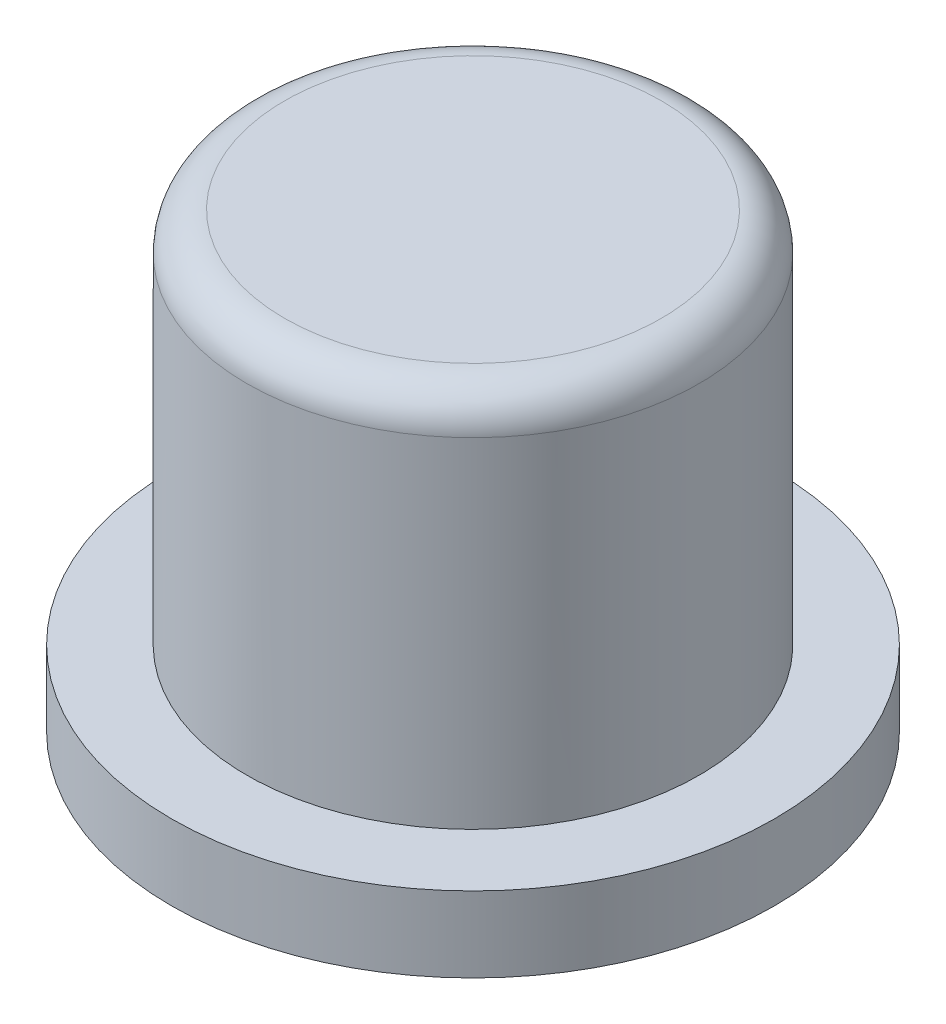
ISO-10303-21;
HEADER;
FILE_DESCRIPTION(('STEP AP214'),'2;1');
FILE_NAME('part.step','',(''),(''),'','','');
FILE_SCHEMA(('AUTOMOTIVE_DESIGN { 1 0 10303 214 1 1 1 1 }'));
ENDSEC;
DATA;
#1=APPLICATION_CONTEXT('core data for automotive mechanical design processes');
#2=APPLICATION_PROTOCOL_DEFINITION('international standard','automotive_design',2000,#1);
#3=PRODUCT_CONTEXT('',#1,'mechanical');
#4=PRODUCT('Part','Part','',(#3));
#5=PRODUCT_RELATED_PRODUCT_CATEGORY('part','',(#4));
#6=PRODUCT_DEFINITION_FORMATION('','',#4);
#7=PRODUCT_DEFINITION_CONTEXT('part definition',#1,'design');
#8=PRODUCT_DEFINITION('design','',#6,#7);
#9=PRODUCT_DEFINITION_SHAPE('','',#8);
#10=(LENGTH_UNIT() NAMED_UNIT(*) SI_UNIT(.MILLI.,.METRE.));
#11=(NAMED_UNIT(*) PLANE_ANGLE_UNIT() SI_UNIT($,.RADIAN.));
#12=(NAMED_UNIT(*) SI_UNIT($,.STERADIAN.) SOLID_ANGLE_UNIT());
#13=UNCERTAINTY_MEASURE_WITH_UNIT(LENGTH_MEASURE(1.E-05),#10,'distance_accuracy_value','');
#14=(GEOMETRIC_REPRESENTATION_CONTEXT(3) GLOBAL_UNCERTAINTY_ASSIGNED_CONTEXT((#13)) GLOBAL_UNIT_ASSIGNED_CONTEXT((#10,
#11,#12)) REPRESENTATION_CONTEXT('',''));
#15=CARTESIAN_POINT('',(0.,0.,0.));
#16=DIRECTION('',(0.,0.,1.));
#17=DIRECTION('',(1.,0.,0.));
#18=AXIS2_PLACEMENT_3D('',#15,#16,#17);
#19=CARTESIAN_POINT('',(0.,63.5,0.));
#20=DIRECTION('',(0.,-1.,0.));
#21=DIRECTION('',(0.,0.,-1.));
#22=AXIS2_PLACEMENT_3D('',#19,#20,#21);
#23=CYLINDRICAL_SURFACE('',#22,38.1);
#24=CARTESIAN_POINT('',(0.,57.15,0.));
#25=DIRECTION('',(0.,1.,0.));
#26=DIRECTION('',(0.,0.,1.));
#27=AXIS2_PLACEMENT_3D('',#24,#25,#26);
#28=CIRCLE('',#27,38.1);
#29=CARTESIAN_POINT('',(0.,57.15,38.1));
#30=VERTEX_POINT('',#29);
#31=EDGE_CURVE('E10',#30,#30,#28,.F.);
#32=ORIENTED_EDGE('',*,*,#31,.T.);
#33=EDGE_LOOP('',(#32));
#34=FACE_BOUND('',#33,.T.);
#35=CARTESIAN_POINT('',(0.,0.,0.));
#36=DIRECTION('',(0.,-1.,0.));
#37=DIRECTION('',(0.,0.,-1.));
#38=AXIS2_PLACEMENT_3D('',#35,#36,#37);
#39=CIRCLE('',#38,38.1);
#40=CARTESIAN_POINT('',(0.,0.,-38.1));
#41=VERTEX_POINT('',#40);
#42=EDGE_CURVE('E42',#41,#41,#39,.T.);
#43=ORIENTED_EDGE('',*,*,#42,.F.);
#44=EDGE_LOOP('',(#43));
#45=FACE_BOUND('',#44,.T.);
#46=ADVANCED_FACE('F31',(#34,#45),#23,.T.);
#47=CARTESIAN_POINT('',(0.,63.5,0.));
#48=DIRECTION('',(0.,1.,0.));
#49=DIRECTION('',(0.,0.,1.));
#50=AXIS2_PLACEMENT_3D('',#47,#48,#49);
#51=PLANE('',#50);
#52=CARTESIAN_POINT('',(0.,63.5,0.));
#53=DIRECTION('',(0.,1.,0.));
#54=DIRECTION('',(0.,0.,1.));
#55=AXIS2_PLACEMENT_3D('',#52,#53,#54);
#56=CIRCLE('',#55,31.75);
#57=CARTESIAN_POINT('',(0.,63.5,31.75));
#58=VERTEX_POINT('',#57);
#59=EDGE_CURVE('E38',#58,#58,#56,.T.);
#60=ORIENTED_EDGE('',*,*,#59,.T.);
#61=EDGE_LOOP('',(#60));
#62=FACE_BOUND('',#61,.T.);
#63=ADVANCED_FACE('F60',(#62),#51,.T.);
#64=CARTESIAN_POINT('',(0.,-12.7,0.));
#65=DIRECTION('',(0.,1.,0.));
#66=DIRECTION('',(0.,0.,1.));
#67=AXIS2_PLACEMENT_3D('',#64,#65,#66);
#68=CYLINDRICAL_SURFACE('',#67,50.8);
#69=CARTESIAN_POINT('',(0.,-12.7,0.));
#70=DIRECTION('',(0.,-1.,0.));
#71=DIRECTION('',(0.,0.,-1.));
#72=AXIS2_PLACEMENT_3D('',#69,#70,#71);
#73=CIRCLE('',#72,50.8);
#74=CARTESIAN_POINT('',(0.,-12.7,-50.8));
#75=VERTEX_POINT('',#74);
#76=EDGE_CURVE('E46',#75,#75,#73,.T.);
#77=ORIENTED_EDGE('',*,*,#76,.F.);
#78=EDGE_LOOP('',(#77));
#79=FACE_BOUND('',#78,.T.);
#80=CARTESIAN_POINT('',(0.,0.,0.));
#81=DIRECTION('',(0.,-1.,0.));
#82=DIRECTION('',(0.,0.,-1.));
#83=AXIS2_PLACEMENT_3D('',#80,#81,#82);
#84=CIRCLE('',#83,50.8);
#85=CARTESIAN_POINT('',(0.,0.,-50.8));
#86=VERTEX_POINT('',#85);
#87=EDGE_CURVE('E49',#86,#86,#84,.T.);
#88=ORIENTED_EDGE('',*,*,#87,.T.);
#89=EDGE_LOOP('',(#88));
#90=FACE_BOUND('',#89,.T.);
#91=ADVANCED_FACE('F57',(#79,#90),#68,.T.);
#92=CARTESIAN_POINT('',(0.,-12.7,0.));
#93=DIRECTION('',(0.,-1.,0.));
#94=DIRECTION('',(0.,0.,-1.));
#95=AXIS2_PLACEMENT_3D('',#92,#93,#94);
#96=PLANE('',#95);
#97=ORIENTED_EDGE('',*,*,#76,.T.);
#98=EDGE_LOOP('',(#97));
#99=FACE_BOUND('',#98,.T.);
#100=ADVANCED_FACE('F55',(#99),#96,.T.);
#101=CARTESIAN_POINT('',(0.,0.,0.));
#102=DIRECTION('',(0.,-1.,0.));
#103=DIRECTION('',(0.,0.,-1.));
#104=AXIS2_PLACEMENT_3D('',#101,#102,#103);
#105=PLANE('',#104);
#106=ORIENTED_EDGE('',*,*,#42,.T.);
#107=EDGE_LOOP('',(#106));
#108=FACE_BOUND('',#107,.T.);
#109=ORIENTED_EDGE('',*,*,#87,.F.);
#110=EDGE_LOOP('',(#109));
#111=FACE_BOUND('',#110,.T.);
#112=ADVANCED_FACE('F64',(#108,#111),#105,.F.);
#113=CARTESIAN_POINT('',(0.,57.15,0.));
#114=DIRECTION('',(0.,1.,0.));
#115=DIRECTION('',(0.,0.,1.));
#116=AXIS2_PLACEMENT_3D('',#113,#114,#115);
#117=TOROIDAL_SURFACE('',#116,31.75,6.35);
#118=ORIENTED_EDGE('',*,*,#31,.F.);
#119=EDGE_LOOP('',(#118));
#120=FACE_BOUND('',#119,.T.);
#121=ORIENTED_EDGE('',*,*,#59,.F.);
#122=EDGE_LOOP('',(#121));
#123=FACE_BOUND('',#122,.T.);
#124=ADVANCED_FACE('F33',(#120,#123),#117,.T.);
#125=CLOSED_SHELL('',(#46,#63,#91,#100,#112,#124));
#126=MANIFOLD_SOLID_BREP('B2',#125);
#127=ADVANCED_BREP_SHAPE_REPRESENTATION('',(#18,#126),#14);
#128=SHAPE_DEFINITION_REPRESENTATION(#9,#127);
ENDSEC;
END-ISO-10303-21;
